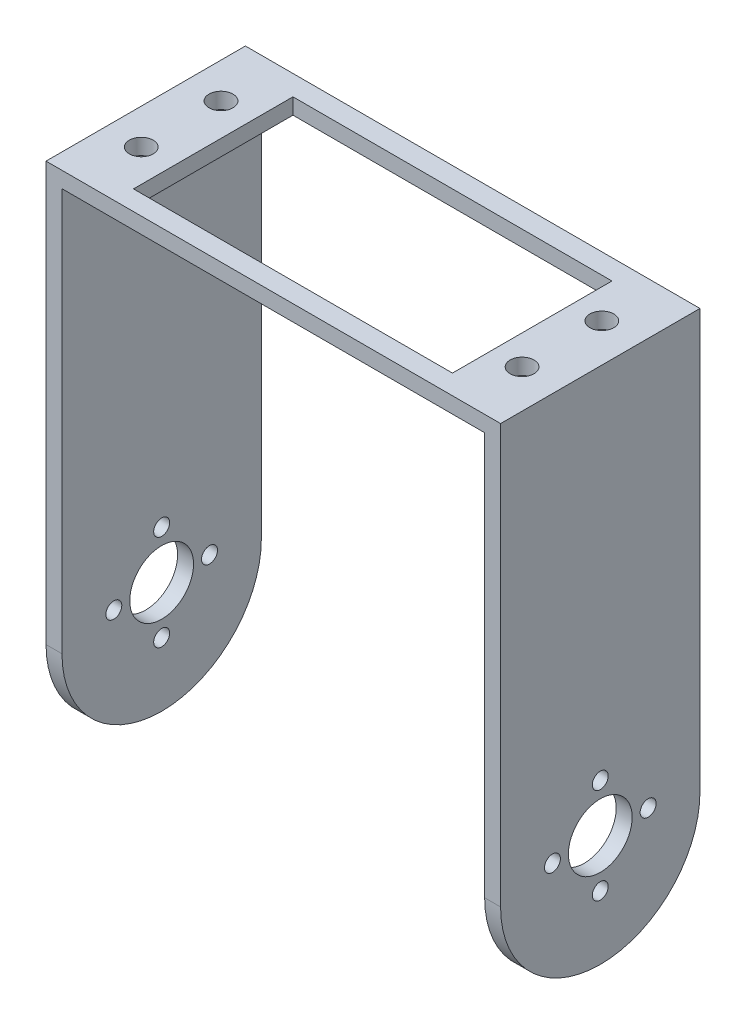
ISO-10303-21;
HEADER;
FILE_DESCRIPTION(('STEP AP214'),'2;1');
FILE_NAME('part.step','',(''),(''),'','','');
FILE_SCHEMA(('AUTOMOTIVE_DESIGN { 1 0 10303 214 1 1 1 1 }'));
ENDSEC;
DATA;
#1=APPLICATION_CONTEXT('core data for automotive mechanical design processes');
#2=APPLICATION_PROTOCOL_DEFINITION('international standard','automotive_design',2000,#1);
#3=PRODUCT_CONTEXT('',#1,'mechanical');
#4=PRODUCT('Part','Part','',(#3));
#5=PRODUCT_RELATED_PRODUCT_CATEGORY('part','',(#4));
#6=PRODUCT_DEFINITION_FORMATION('','',#4);
#7=PRODUCT_DEFINITION_CONTEXT('part definition',#1,'design');
#8=PRODUCT_DEFINITION('design','',#6,#7);
#9=PRODUCT_DEFINITION_SHAPE('','',#8);
#10=(LENGTH_UNIT() NAMED_UNIT(*) SI_UNIT(.MILLI.,.METRE.));
#11=(NAMED_UNIT(*) PLANE_ANGLE_UNIT() SI_UNIT($,.RADIAN.));
#12=(NAMED_UNIT(*) SI_UNIT($,.STERADIAN.) SOLID_ANGLE_UNIT());
#13=UNCERTAINTY_MEASURE_WITH_UNIT(LENGTH_MEASURE(1.E-05),#10,'distance_accuracy_value','');
#14=(GEOMETRIC_REPRESENTATION_CONTEXT(3) GLOBAL_UNCERTAINTY_ASSIGNED_CONTEXT((#13)) GLOBAL_UNIT_ASSIGNED_CONTEXT((#10,
#11,#12)) REPRESENTATION_CONTEXT('',''));
#15=CARTESIAN_POINT('',(0.,0.,0.));
#16=DIRECTION('',(0.,0.,1.));
#17=DIRECTION('',(1.,0.,0.));
#18=AXIS2_PLACEMENT_3D('',#15,#16,#17);
#19=CARTESIAN_POINT('',(-79.925523148209,43.3899538371544,25.));
#20=DIRECTION('',(-1.,0.,0.));
#21=DIRECTION('',(0.,0.,1.));
#22=AXIS2_PLACEMENT_3D('',#19,#20,#21);
#23=PLANE('',#22);
#24=CARTESIAN_POINT('',(-79.925523148209,0.386502583504423,12.5));
#25=DIRECTION('',(-1.,0.,0.));
#26=DIRECTION('',(0.,0.,1.));
#27=AXIS2_PLACEMENT_3D('',#24,#25,#26);
#28=CIRCLE('',#27,1.);
#29=CARTESIAN_POINT('',(-79.925523148209,0.386502583504423,13.5));
#30=VERTEX_POINT('',#29);
#31=EDGE_CURVE('E180',#30,#30,#28,.T.);
#32=ORIENTED_EDGE('',*,*,#31,.T.);
#33=EDGE_LOOP('',(#32));
#34=FACE_BOUND('',#33,.T.);
#35=CARTESIAN_POINT('',(-79.925523148209,-5.6134974164956,18.4999999999999));
#36=DIRECTION('',(-1.,0.,0.));
#37=DIRECTION('',(0.,0.,1.));
#38=AXIS2_PLACEMENT_3D('',#35,#36,#37);
#39=CIRCLE('',#38,1.);
#40=CARTESIAN_POINT('',(-79.925523148209,-5.6134974164956,19.4999999999999));
#41=VERTEX_POINT('',#40);
#42=EDGE_CURVE('E192',#41,#41,#39,.T.);
#43=ORIENTED_EDGE('',*,*,#42,.T.);
#44=EDGE_LOOP('',(#43));
#45=FACE_BOUND('',#44,.T.);
#46=CARTESIAN_POINT('',(-79.925523148209,-11.6134974164956,12.4999999999999));
#47=DIRECTION('',(-1.,0.,0.));
#48=DIRECTION('',(0.,0.,1.));
#49=AXIS2_PLACEMENT_3D('',#46,#47,#48);
#50=CIRCLE('',#49,1.);
#51=CARTESIAN_POINT('',(-79.925523148209,-11.6134974164956,13.4999999999999));
#52=VERTEX_POINT('',#51);
#53=EDGE_CURVE('E204',#52,#52,#50,.T.);
#54=ORIENTED_EDGE('',*,*,#53,.T.);
#55=EDGE_LOOP('',(#54));
#56=FACE_BOUND('',#55,.T.);
#57=CARTESIAN_POINT('',(-79.925523148209,-5.61349741649551,6.49999999999991));
#58=DIRECTION('',(-1.,0.,0.));
#59=DIRECTION('',(0.,0.,1.));
#60=AXIS2_PLACEMENT_3D('',#57,#58,#59);
#61=CIRCLE('',#60,1.);
#62=CARTESIAN_POINT('',(-79.925523148209,-5.61349741649551,7.49999999999992));
#63=VERTEX_POINT('',#62);
#64=EDGE_CURVE('E216',#63,#63,#61,.T.);
#65=ORIENTED_EDGE('',*,*,#64,.T.);
#66=EDGE_LOOP('',(#65));
#67=FACE_BOUND('',#66,.T.);
#68=CARTESIAN_POINT('',(-79.925523148209,-5.61349741649557,12.5));
#69=DIRECTION('',(-1.,0.,0.));
#70=DIRECTION('',(0.,0.,1.));
#71=AXIS2_PLACEMENT_3D('',#68,#69,#70);
#72=CIRCLE('',#71,4.);
#73=CARTESIAN_POINT('',(-79.925523148209,-5.61349741649557,16.5));
#74=VERTEX_POINT('',#73);
#75=EDGE_CURVE('E242',#74,#74,#72,.T.);
#76=ORIENTED_EDGE('',*,*,#75,.T.);
#77=EDGE_LOOP('',(#76));
#78=FACE_BOUND('',#77,.T.);
#79=DIRECTION('',(0.,1.,0.));
#80=VECTOR('',#79,1.);
#81=CARTESIAN_POINT('',(-79.925523148209,43.3899538371544,25.));
#82=LINE('',#81,#80);
#83=CARTESIAN_POINT('',(-79.925523148209,-7.11349741649558,25.));
#84=VERTEX_POINT('',#83);
#85=CARTESIAN_POINT('',(-79.925523148209,43.3899538371544,25.));
#86=VERTEX_POINT('',#85);
#87=EDGE_CURVE('E246',#84,#86,#82,.T.);
#88=ORIENTED_EDGE('',*,*,#87,.F.);
#89=CARTESIAN_POINT('',(-79.925523148209,-7.11349741649558,12.5));
#90=DIRECTION('',(-1.,0.,0.));
#91=DIRECTION('',(0.,0.,1.));
#92=AXIS2_PLACEMENT_3D('',#89,#90,#91);
#93=CIRCLE('',#92,12.5);
#94=CARTESIAN_POINT('',(-79.925523148209,-7.11349741649558,0.));
#95=VERTEX_POINT('',#94);
#96=EDGE_CURVE('E231',#95,#84,#93,.T.);
#97=ORIENTED_EDGE('',*,*,#96,.F.);
#98=DIRECTION('',(0.,1.,0.));
#99=VECTOR('',#98,1.);
#100=CARTESIAN_POINT('',(-79.925523148209,43.3899538371544,0.));
#101=LINE('',#100,#99);
#102=CARTESIAN_POINT('',(-79.925523148209,43.3899538371544,0.));
#103=VERTEX_POINT('',#102);
#104=EDGE_CURVE('E245',#95,#103,#101,.T.);
#105=ORIENTED_EDGE('',*,*,#104,.T.);
#106=DIRECTION('',(0.,0.,-1.));
#107=VECTOR('',#106,1.);
#108=CARTESIAN_POINT('',(-79.925523148209,43.3899538371544,25.));
#109=LINE('',#108,#107);
#110=EDGE_CURVE('E282',#86,#103,#109,.T.);
#111=ORIENTED_EDGE('',*,*,#110,.F.);
#112=EDGE_LOOP('',(#88,#97,#105,#111));
#113=FACE_BOUND('',#112,.T.);
#114=ADVANCED_FACE('F34',(#34,#45,#56,#67,#78,#113),#23,.F.);
#115=CARTESIAN_POINT('',(-26.925523148209,43.3899538371544,25.));
#116=DIRECTION('',(1.,0.,0.));
#117=DIRECTION('',(0.,1.,0.));
#118=AXIS2_PLACEMENT_3D('',#115,#116,#117);
#119=PLANE('',#118);
#120=CARTESIAN_POINT('',(-26.925523148209,0.38650258350444,12.5));
#121=DIRECTION('',(1.,0.,0.));
#122=DIRECTION('',(0.,1.,0.));
#123=AXIS2_PLACEMENT_3D('',#120,#121,#122);
#124=CIRCLE('',#123,1.);
#125=CARTESIAN_POINT('',(-26.925523148209,1.38650258350444,12.5));
#126=VERTEX_POINT('',#125);
#127=EDGE_CURVE('E175',#126,#126,#124,.T.);
#128=ORIENTED_EDGE('',*,*,#127,.T.);
#129=EDGE_LOOP('',(#128));
#130=FACE_BOUND('',#129,.T.);
#131=CARTESIAN_POINT('',(-26.925523148209,-5.61349741649558,18.4999999999999));
#132=DIRECTION('',(1.,0.,0.));
#133=DIRECTION('',(0.,1.,0.));
#134=AXIS2_PLACEMENT_3D('',#131,#132,#133);
#135=CIRCLE('',#134,1.);
#136=CARTESIAN_POINT('',(-26.925523148209,-4.61349741649558,18.4999999999999));
#137=VERTEX_POINT('',#136);
#138=EDGE_CURVE('E187',#137,#137,#135,.T.);
#139=ORIENTED_EDGE('',*,*,#138,.T.);
#140=EDGE_LOOP('',(#139));
#141=FACE_BOUND('',#140,.T.);
#142=CARTESIAN_POINT('',(-26.925523148209,-11.6134974164956,12.4999999999999));
#143=DIRECTION('',(1.,0.,0.));
#144=DIRECTION('',(0.,1.,0.));
#145=AXIS2_PLACEMENT_3D('',#142,#143,#144);
#146=CIRCLE('',#145,1.);
#147=CARTESIAN_POINT('',(-26.925523148209,-10.6134974164956,12.4999999999999));
#148=VERTEX_POINT('',#147);
#149=EDGE_CURVE('E199',#148,#148,#146,.T.);
#150=ORIENTED_EDGE('',*,*,#149,.T.);
#151=EDGE_LOOP('',(#150));
#152=FACE_BOUND('',#151,.T.);
#153=CARTESIAN_POINT('',(-26.925523148209,-5.6134974164955,6.49999999999991));
#154=DIRECTION('',(1.,0.,0.));
#155=DIRECTION('',(0.,1.,0.));
#156=AXIS2_PLACEMENT_3D('',#153,#154,#155);
#157=CIRCLE('',#156,1.);
#158=CARTESIAN_POINT('',(-26.925523148209,-4.6134974164955,6.49999999999991));
#159=VERTEX_POINT('',#158);
#160=EDGE_CURVE('E211',#159,#159,#157,.T.);
#161=ORIENTED_EDGE('',*,*,#160,.T.);
#162=EDGE_LOOP('',(#161));
#163=FACE_BOUND('',#162,.T.);
#164=CARTESIAN_POINT('',(-26.925523148209,-5.61349741649556,12.5));
#165=DIRECTION('',(1.,0.,0.));
#166=DIRECTION('',(0.,1.,0.));
#167=AXIS2_PLACEMENT_3D('',#164,#165,#166);
#168=CIRCLE('',#167,4.);
#169=CARTESIAN_POINT('',(-26.925523148209,-1.61349741649556,12.5));
#170=VERTEX_POINT('',#169);
#171=EDGE_CURVE('E237',#170,#170,#168,.T.);
#172=ORIENTED_EDGE('',*,*,#171,.T.);
#173=EDGE_LOOP('',(#172));
#174=FACE_BOUND('',#173,.T.);
#175=CARTESIAN_POINT('',(-26.925523148209,-7.11349741649557,12.5));
#176=DIRECTION('',(1.,0.,0.));
#177=DIRECTION('',(0.,1.,0.));
#178=AXIS2_PLACEMENT_3D('',#175,#176,#177);
#179=CIRCLE('',#178,12.5);
#180=CARTESIAN_POINT('',(-26.925523148209,-7.11349741649557,25.));
#181=VERTEX_POINT('',#180);
#182=CARTESIAN_POINT('',(-26.925523148209,-7.11349741649558,0.));
#183=VERTEX_POINT('',#182);
#184=EDGE_CURVE('E229',#181,#183,#179,.T.);
#185=ORIENTED_EDGE('',*,*,#184,.F.);
#186=DIRECTION('',(0.,-1.,0.));
#187=VECTOR('',#186,1.);
#188=CARTESIAN_POINT('',(-26.925523148209,43.3899538371544,25.));
#189=LINE('',#188,#187);
#190=CARTESIAN_POINT('',(-26.925523148209,43.3899538371544,25.));
#191=VERTEX_POINT('',#190);
#192=EDGE_CURVE('E251',#191,#181,#189,.T.);
#193=ORIENTED_EDGE('',*,*,#192,.F.);
#194=DIRECTION('',(0.,0.,-1.));
#195=VECTOR('',#194,1.);
#196=CARTESIAN_POINT('',(-26.925523148209,43.3899538371544,25.));
#197=LINE('',#196,#195);
#198=CARTESIAN_POINT('',(-26.925523148209,43.3899538371544,0.));
#199=VERTEX_POINT('',#198);
#200=EDGE_CURVE('E279',#191,#199,#197,.T.);
#201=ORIENTED_EDGE('',*,*,#200,.T.);
#202=DIRECTION('',(0.,-1.,0.));
#203=VECTOR('',#202,1.);
#204=CARTESIAN_POINT('',(-26.925523148209,43.3899538371544,0.));
#205=LINE('',#204,#203);
#206=EDGE_CURVE('E265',#199,#183,#205,.T.);
#207=ORIENTED_EDGE('',*,*,#206,.T.);
#208=EDGE_LOOP('',(#185,#193,#201,#207));
#209=FACE_BOUND('',#208,.T.);
#210=ADVANCED_FACE('F314',(#130,#141,#152,#163,#174,#209),#119,.F.);
#211=CARTESIAN_POINT('',(-24.925523148209,45.3865025835044,25.));
#212=DIRECTION('',(-1.,0.,0.));
#213=DIRECTION('',(0.,-1.,0.));
#214=AXIS2_PLACEMENT_3D('',#211,#212,#213);
#215=PLANE('',#214);
#216=CARTESIAN_POINT('',(-24.925523148209,0.38650258350444,12.5));
#217=DIRECTION('',(1.,0.,0.));
#218=DIRECTION('',(0.,1.,0.));
#219=AXIS2_PLACEMENT_3D('',#216,#217,#218);
#220=CIRCLE('',#219,1.);
#221=CARTESIAN_POINT('',(-24.925523148209,1.38650258350444,12.5));
#222=VERTEX_POINT('',#221);
#223=EDGE_CURVE('E171',#222,#222,#220,.T.);
#224=ORIENTED_EDGE('',*,*,#223,.F.);
#225=EDGE_LOOP('',(#224));
#226=FACE_BOUND('',#225,.T.);
#227=CARTESIAN_POINT('',(-24.925523148209,-5.61349741649558,18.4999999999999));
#228=DIRECTION('',(1.,0.,0.));
#229=DIRECTION('',(0.,1.,0.));
#230=AXIS2_PLACEMENT_3D('',#227,#228,#229);
#231=CIRCLE('',#230,1.);
#232=CARTESIAN_POINT('',(-24.925523148209,-4.61349741649558,18.4999999999999));
#233=VERTEX_POINT('',#232);
#234=EDGE_CURVE('E183',#233,#233,#231,.T.);
#235=ORIENTED_EDGE('',*,*,#234,.F.);
#236=EDGE_LOOP('',(#235));
#237=FACE_BOUND('',#236,.T.);
#238=CARTESIAN_POINT('',(-24.925523148209,-11.6134974164956,12.4999999999999));
#239=DIRECTION('',(1.,0.,0.));
#240=DIRECTION('',(0.,1.,0.));
#241=AXIS2_PLACEMENT_3D('',#238,#239,#240);
#242=CIRCLE('',#241,1.);
#243=CARTESIAN_POINT('',(-24.925523148209,-10.6134974164956,12.4999999999999));
#244=VERTEX_POINT('',#243);
#245=EDGE_CURVE('E195',#244,#244,#242,.T.);
#246=ORIENTED_EDGE('',*,*,#245,.F.);
#247=EDGE_LOOP('',(#246));
#248=FACE_BOUND('',#247,.T.);
#249=CARTESIAN_POINT('',(-24.925523148209,-5.6134974164955,6.49999999999991));
#250=DIRECTION('',(1.,0.,0.));
#251=DIRECTION('',(0.,1.,0.));
#252=AXIS2_PLACEMENT_3D('',#249,#250,#251);
#253=CIRCLE('',#252,1.);
#254=CARTESIAN_POINT('',(-24.925523148209,-4.61349741649549,6.49999999999991));
#255=VERTEX_POINT('',#254);
#256=EDGE_CURVE('E207',#255,#255,#253,.T.);
#257=ORIENTED_EDGE('',*,*,#256,.F.);
#258=EDGE_LOOP('',(#257));
#259=FACE_BOUND('',#258,.T.);
#260=CARTESIAN_POINT('',(-24.9255231482089,-5.61349741649556,12.5));
#261=DIRECTION('',(-1.,0.,0.));
#262=DIRECTION('',(0.,-1.,0.));
#263=AXIS2_PLACEMENT_3D('',#260,#261,#262);
#264=CIRCLE('',#263,4.);
#265=CARTESIAN_POINT('',(-24.9255231482089,-9.61349741649556,12.5));
#266=VERTEX_POINT('',#265);
#267=EDGE_CURVE('E234',#266,#266,#264,.T.);
#268=ORIENTED_EDGE('',*,*,#267,.T.);
#269=EDGE_LOOP('',(#268));
#270=FACE_BOUND('',#269,.T.);
#271=DIRECTION('',(0.,1.,0.));
#272=VECTOR('',#271,1.);
#273=CARTESIAN_POINT('',(-24.925523148209,45.3865025835044,25.));
#274=LINE('',#273,#272);
#275=CARTESIAN_POINT('',(-24.9255231482089,-7.11349741649557,25.));
#276=VERTEX_POINT('',#275);
#277=CARTESIAN_POINT('',(-24.925523148209,45.3865025835044,25.));
#278=VERTEX_POINT('',#277);
#279=EDGE_CURVE('E254',#276,#278,#274,.T.);
#280=ORIENTED_EDGE('',*,*,#279,.F.);
#281=CARTESIAN_POINT('',(-24.9255231482089,-7.11349741649557,12.5));
#282=DIRECTION('',(-1.,0.,0.));
#283=DIRECTION('',(0.,-1.,0.));
#284=AXIS2_PLACEMENT_3D('',#281,#282,#283);
#285=CIRCLE('',#284,12.5);
#286=CARTESIAN_POINT('',(-24.9255231482089,-7.11349741649557,0.));
#287=VERTEX_POINT('',#286);
#288=EDGE_CURVE('E223',#287,#276,#285,.T.);
#289=ORIENTED_EDGE('',*,*,#288,.F.);
#290=DIRECTION('',(0.,1.,0.));
#291=VECTOR('',#290,1.);
#292=CARTESIAN_POINT('',(-24.925523148209,45.3865025835044,0.));
#293=LINE('',#292,#291);
#294=CARTESIAN_POINT('',(-24.925523148209,45.3865025835044,0.));
#295=VERTEX_POINT('',#294);
#296=EDGE_CURVE('E268',#287,#295,#293,.T.);
#297=ORIENTED_EDGE('',*,*,#296,.T.);
#298=DIRECTION('',(0.,0.,-1.));
#299=VECTOR('',#298,1.);
#300=CARTESIAN_POINT('',(-24.925523148209,45.3865025835044,25.));
#301=LINE('',#300,#299);
#302=EDGE_CURVE('E276',#278,#295,#301,.T.);
#303=ORIENTED_EDGE('',*,*,#302,.F.);
#304=EDGE_LOOP('',(#280,#289,#297,#303));
#305=FACE_BOUND('',#304,.T.);
#306=ADVANCED_FACE('F304',(#226,#237,#248,#259,#270,#305),#215,.F.);
#307=CARTESIAN_POINT('',(-81.925523148209,45.3865025835044,25.));
#308=DIRECTION('',(1.,0.,0.));
#309=DIRECTION('',(0.,1.,0.));
#310=AXIS2_PLACEMENT_3D('',#307,#308,#309);
#311=PLANE('',#310);
#312=CARTESIAN_POINT('',(-81.925523148209,0.386502583504422,12.5));
#313=DIRECTION('',(1.,0.,0.));
#314=DIRECTION('',(0.,1.,0.));
#315=AXIS2_PLACEMENT_3D('',#312,#313,#314);
#316=CIRCLE('',#315,1.);
#317=CARTESIAN_POINT('',(-81.925523148209,1.38650258350442,12.5));
#318=VERTEX_POINT('',#317);
#319=EDGE_CURVE('E172',#318,#318,#316,.T.);
#320=ORIENTED_EDGE('',*,*,#319,.T.);
#321=EDGE_LOOP('',(#320));
#322=FACE_BOUND('',#321,.T.);
#323=CARTESIAN_POINT('',(-81.925523148209,-5.6134974164956,18.4999999999999));
#324=DIRECTION('',(1.,0.,0.));
#325=DIRECTION('',(0.,1.,0.));
#326=AXIS2_PLACEMENT_3D('',#323,#324,#325);
#327=CIRCLE('',#326,1.);
#328=CARTESIAN_POINT('',(-81.925523148209,-4.6134974164956,18.4999999999999));
#329=VERTEX_POINT('',#328);
#330=EDGE_CURVE('E184',#329,#329,#327,.T.);
#331=ORIENTED_EDGE('',*,*,#330,.T.);
#332=EDGE_LOOP('',(#331));
#333=FACE_BOUND('',#332,.T.);
#334=CARTESIAN_POINT('',(-81.925523148209,-11.6134974164956,12.4999999999999));
#335=DIRECTION('',(1.,0.,0.));
#336=DIRECTION('',(0.,1.,0.));
#337=AXIS2_PLACEMENT_3D('',#334,#335,#336);
#338=CIRCLE('',#337,1.);
#339=CARTESIAN_POINT('',(-81.925523148209,-10.6134974164956,12.4999999999999));
#340=VERTEX_POINT('',#339);
#341=EDGE_CURVE('E196',#340,#340,#338,.T.);
#342=ORIENTED_EDGE('',*,*,#341,.T.);
#343=EDGE_LOOP('',(#342));
#344=FACE_BOUND('',#343,.T.);
#345=CARTESIAN_POINT('',(-81.925523148209,-5.61349741649551,6.49999999999991));
#346=DIRECTION('',(1.,0.,0.));
#347=DIRECTION('',(0.,1.,0.));
#348=AXIS2_PLACEMENT_3D('',#345,#346,#347);
#349=CIRCLE('',#348,1.);
#350=CARTESIAN_POINT('',(-81.925523148209,-4.61349741649551,6.49999999999991));
#351=VERTEX_POINT('',#350);
#352=EDGE_CURVE('E208',#351,#351,#349,.T.);
#353=ORIENTED_EDGE('',*,*,#352,.T.);
#354=EDGE_LOOP('',(#353));
#355=FACE_BOUND('',#354,.T.);
#356=CARTESIAN_POINT('',(-81.925523148209,-5.61349741649557,12.5));
#357=DIRECTION('',(-1.,0.,0.));
#358=DIRECTION('',(0.,-1.,0.));
#359=AXIS2_PLACEMENT_3D('',#356,#357,#358);
#360=CIRCLE('',#359,4.);
#361=CARTESIAN_POINT('',(-81.925523148209,-9.61349741649557,12.5));
#362=VERTEX_POINT('',#361);
#363=EDGE_CURVE('E233',#362,#362,#360,.T.);
#364=ORIENTED_EDGE('',*,*,#363,.F.);
#365=EDGE_LOOP('',(#364));
#366=FACE_BOUND('',#365,.T.);
#367=CARTESIAN_POINT('',(-81.925523148209,-7.11349741649558,12.5));
#368=DIRECTION('',(-1.,0.,0.));
#369=DIRECTION('',(0.,-1.,0.));
#370=AXIS2_PLACEMENT_3D('',#367,#368,#369);
#371=CIRCLE('',#370,12.5);
#372=CARTESIAN_POINT('',(-81.925523148209,-7.11349741649558,0.));
#373=VERTEX_POINT('',#372);
#374=CARTESIAN_POINT('',(-81.925523148209,-7.11349741649558,25.));
#375=VERTEX_POINT('',#374);
#376=EDGE_CURVE('E222',#373,#375,#371,.T.);
#377=ORIENTED_EDGE('',*,*,#376,.T.);
#378=DIRECTION('',(0.,-1.,0.));
#379=VECTOR('',#378,1.);
#380=CARTESIAN_POINT('',(-81.925523148209,45.3865025835044,25.));
#381=LINE('',#380,#379);
#382=CARTESIAN_POINT('',(-81.925523148209,45.3865025835044,25.));
#383=VERTEX_POINT('',#382);
#384=EDGE_CURVE('E258',#383,#375,#381,.T.);
#385=ORIENTED_EDGE('',*,*,#384,.F.);
#386=DIRECTION('',(0.,0.,-1.));
#387=VECTOR('',#386,1.);
#388=CARTESIAN_POINT('',(-81.925523148209,45.3865025835044,25.));
#389=LINE('',#388,#387);
#390=CARTESIAN_POINT('',(-81.925523148209,45.3865025835044,0.));
#391=VERTEX_POINT('',#390);
#392=EDGE_CURVE('E261',#383,#391,#389,.T.);
#393=ORIENTED_EDGE('',*,*,#392,.T.);
#394=DIRECTION('',(0.,-1.,0.));
#395=VECTOR('',#394,1.);
#396=CARTESIAN_POINT('',(-81.925523148209,45.3865025835044,0.));
#397=LINE('',#396,#395);
#398=EDGE_CURVE('E249',#391,#373,#397,.T.);
#399=ORIENTED_EDGE('',*,*,#398,.T.);
#400=EDGE_LOOP('',(#377,#385,#393,#399));
#401=FACE_BOUND('',#400,.T.);
#402=ADVANCED_FACE('F295',(#322,#333,#344,#355,#366,#401),#311,.F.);
#403=CARTESIAN_POINT('',(-79.925523148209,43.3899538371544,25.));
#404=DIRECTION('',(0.,1.,0.));
#405=DIRECTION('',(0.,0.,1.));
#406=AXIS2_PLACEMENT_3D('',#403,#404,#405);
#407=PLANE('',#406);
#408=CARTESIAN_POINT('',(-29.7325728017672,43.3899538371544,7.5));
#409=DIRECTION('',(0.,1.,0.));
#410=DIRECTION('',(0.,0.,1.));
#411=AXIS2_PLACEMENT_3D('',#408,#409,#410);
#412=CIRCLE('',#411,1.5);
#413=CARTESIAN_POINT('',(-29.7325728017672,43.3899538371544,9.));
#414=VERTEX_POINT('',#413);
#415=EDGE_CURVE('E168',#414,#414,#412,.T.);
#416=ORIENTED_EDGE('',*,*,#415,.T.);
#417=EDGE_LOOP('',(#416));
#418=FACE_BOUND('',#417,.T.);
#419=CARTESIAN_POINT('',(-77.4867576969271,43.3899538371544,7.5));
#420=DIRECTION('',(0.,1.,0.));
#421=DIRECTION('',(0.,0.,1.));
#422=AXIS2_PLACEMENT_3D('',#419,#420,#421);
#423=CIRCLE('',#422,1.5);
#424=CARTESIAN_POINT('',(-77.4867576969271,43.3899538371544,9.));
#425=VERTEX_POINT('',#424);
#426=EDGE_CURVE('E165',#425,#425,#423,.T.);
#427=ORIENTED_EDGE('',*,*,#426,.T.);
#428=EDGE_LOOP('',(#427));
#429=FACE_BOUND('',#428,.T.);
#430=CARTESIAN_POINT('',(-29.7325728017672,43.3899538371544,17.5));
#431=DIRECTION('',(0.,1.,0.));
#432=DIRECTION('',(0.,0.,1.));
#433=AXIS2_PLACEMENT_3D('',#430,#431,#432);
#434=CIRCLE('',#433,1.5);
#435=CARTESIAN_POINT('',(-29.7325728017672,43.3899538371544,19.));
#436=VERTEX_POINT('',#435);
#437=EDGE_CURVE('E162',#436,#436,#434,.T.);
#438=ORIENTED_EDGE('',*,*,#437,.T.);
#439=EDGE_LOOP('',(#438));
#440=FACE_BOUND('',#439,.T.);
#441=CARTESIAN_POINT('',(-77.4867576969271,43.3899538371544,17.5));
#442=DIRECTION('',(0.,1.,0.));
#443=DIRECTION('',(0.,0.,1.));
#444=AXIS2_PLACEMENT_3D('',#441,#442,#443);
#445=CIRCLE('',#444,1.5);
#446=CARTESIAN_POINT('',(-77.4867576969271,43.3899538371544,19.));
#447=VERTEX_POINT('',#446);
#448=EDGE_CURVE('E159',#447,#447,#445,.T.);
#449=ORIENTED_EDGE('',*,*,#448,.T.);
#450=EDGE_LOOP('',(#449));
#451=FACE_BOUND('',#450,.T.);
#452=DIRECTION('',(-1.,0.,0.));
#453=VECTOR('',#452,1.);
#454=CARTESIAN_POINT('',(-79.925523148209,43.3899538371544,2.53574451202888));
#455=LINE('',#454,#453);
#456=CARTESIAN_POINT('',(-33.425523148209,43.3899538371544,2.53574451202888));
#457=VERTEX_POINT('',#456);
#458=CARTESIAN_POINT('',(-73.425523148209,43.3899538371544,2.53574451202888));
#459=VERTEX_POINT('',#458);
#460=EDGE_CURVE('E153',#457,#459,#455,.T.);
#461=ORIENTED_EDGE('',*,*,#460,.T.);
#462=DIRECTION('',(0.,0.,1.));
#463=VECTOR('',#462,1.);
#464=CARTESIAN_POINT('',(-73.425523148209,43.3899538371544,25.));
#465=LINE('',#464,#463);
#466=CARTESIAN_POINT('',(-73.425523148209,43.3899538371544,22.5357445120289));
#467=VERTEX_POINT('',#466);
#468=EDGE_CURVE('E156',#459,#467,#465,.T.);
#469=ORIENTED_EDGE('',*,*,#468,.T.);
#470=DIRECTION('',(1.,0.,0.));
#471=VECTOR('',#470,1.);
#472=CARTESIAN_POINT('',(-79.925523148209,43.3899538371544,22.5357445120289));
#473=LINE('',#472,#471);
#474=CARTESIAN_POINT('',(-33.425523148209,43.3899538371544,22.5357445120289));
#475=VERTEX_POINT('',#474);
#476=EDGE_CURVE('E148',#467,#475,#473,.T.);
#477=ORIENTED_EDGE('',*,*,#476,.T.);
#478=DIRECTION('',(0.,0.,-1.));
#479=VECTOR('',#478,1.);
#480=CARTESIAN_POINT('',(-33.425523148209,43.3899538371544,25.));
#481=LINE('',#480,#479);
#482=EDGE_CURVE('E128',#475,#457,#481,.T.);
#483=ORIENTED_EDGE('',*,*,#482,.T.);
#484=EDGE_LOOP('',(#461,#469,#477,#483));
#485=FACE_BOUND('',#484,.T.);
#486=DIRECTION('',(1.,0.,0.));
#487=VECTOR('',#486,1.);
#488=CARTESIAN_POINT('',(-79.925523148209,43.3899538371544,0.));
#489=LINE('',#488,#487);
#490=EDGE_CURVE('E263',#103,#199,#489,.T.);
#491=ORIENTED_EDGE('',*,*,#490,.T.);
#492=ORIENTED_EDGE('',*,*,#200,.F.);
#493=DIRECTION('',(1.,0.,0.));
#494=VECTOR('',#493,1.);
#495=CARTESIAN_POINT('',(-79.925523148209,43.3899538371544,25.));
#496=LINE('',#495,#494);
#497=EDGE_CURVE('E248',#86,#191,#496,.T.);
#498=ORIENTED_EDGE('',*,*,#497,.F.);
#499=ORIENTED_EDGE('',*,*,#110,.T.);
#500=EDGE_LOOP('',(#491,#492,#498,#499));
#501=FACE_BOUND('',#500,.T.);
#502=ADVANCED_FACE('F317',(#418,#429,#440,#451,#485,#501),#407,.F.);
#503=CARTESIAN_POINT('',(-81.925523148209,45.3865025835044,25.));
#504=DIRECTION('',(0.,-1.,0.));
#505=DIRECTION('',(0.,0.,-1.));
#506=AXIS2_PLACEMENT_3D('',#503,#504,#505);
#507=PLANE('',#506);
#508=CARTESIAN_POINT('',(-29.7325728017672,45.3865025835044,7.5));
#509=DIRECTION('',(0.,1.,0.));
#510=DIRECTION('',(0.,0.,1.));
#511=AXIS2_PLACEMENT_3D('',#508,#509,#510);
#512=CIRCLE('',#511,1.5);
#513=CARTESIAN_POINT('',(-29.7325728017672,45.3865025835044,9.));
#514=VERTEX_POINT('',#513);
#515=EDGE_CURVE('E545',#514,#514,#512,.T.);
#516=ORIENTED_EDGE('',*,*,#515,.F.);
#517=EDGE_LOOP('',(#516));
#518=FACE_BOUND('',#517,.T.);
#519=CARTESIAN_POINT('',(-77.4867576969271,45.3865025835044,7.5));
#520=DIRECTION('',(0.,1.,0.));
#521=DIRECTION('',(0.,0.,1.));
#522=AXIS2_PLACEMENT_3D('',#519,#520,#521);
#523=CIRCLE('',#522,1.5);
#524=CARTESIAN_POINT('',(-77.4867576969271,45.3865025835044,9.));
#525=VERTEX_POINT('',#524);
#526=EDGE_CURVE('E546',#525,#525,#523,.T.);
#527=ORIENTED_EDGE('',*,*,#526,.F.);
#528=EDGE_LOOP('',(#527));
#529=FACE_BOUND('',#528,.T.);
#530=CARTESIAN_POINT('',(-29.7325728017672,45.3865025835044,17.5));
#531=DIRECTION('',(0.,1.,0.));
#532=DIRECTION('',(0.,0.,1.));
#533=AXIS2_PLACEMENT_3D('',#530,#531,#532);
#534=CIRCLE('',#533,1.5);
#535=CARTESIAN_POINT('',(-29.7325728017672,45.3865025835044,19.));
#536=VERTEX_POINT('',#535);
#537=EDGE_CURVE('E549',#536,#536,#534,.T.);
#538=ORIENTED_EDGE('',*,*,#537,.F.);
#539=EDGE_LOOP('',(#538));
#540=FACE_BOUND('',#539,.T.);
#541=CARTESIAN_POINT('',(-77.4867576969271,45.3865025835044,17.5));
#542=DIRECTION('',(0.,1.,0.));
#543=DIRECTION('',(0.,0.,1.));
#544=AXIS2_PLACEMENT_3D('',#541,#542,#543);
#545=CIRCLE('',#544,1.5);
#546=CARTESIAN_POINT('',(-77.4867576969271,45.3865025835044,19.));
#547=VERTEX_POINT('',#546);
#548=EDGE_CURVE('E552',#547,#547,#545,.T.);
#549=ORIENTED_EDGE('',*,*,#548,.F.);
#550=EDGE_LOOP('',(#549));
#551=FACE_BOUND('',#550,.T.);
#552=DIRECTION('',(1.,0.,0.));
#553=VECTOR('',#552,1.);
#554=CARTESIAN_POINT('',(-73.425523148209,45.3865025835044,22.5357445120289));
#555=LINE('',#554,#553);
#556=CARTESIAN_POINT('',(-73.425523148209,45.3865025835044,22.5357445120289));
#557=VERTEX_POINT('',#556);
#558=CARTESIAN_POINT('',(-33.425523148209,45.3865025835044,22.5357445120289));
#559=VERTEX_POINT('',#558);
#560=EDGE_CURVE('E134',#557,#559,#555,.T.);
#561=ORIENTED_EDGE('',*,*,#560,.F.);
#562=DIRECTION('',(0.,0.,1.));
#563=VECTOR('',#562,1.);
#564=CARTESIAN_POINT('',(-73.425523148209,45.3865025835044,2.53574451202888));
#565=LINE('',#564,#563);
#566=CARTESIAN_POINT('',(-73.425523148209,45.3865025835044,2.53574451202888));
#567=VERTEX_POINT('',#566);
#568=EDGE_CURVE('E56',#567,#557,#565,.T.);
#569=ORIENTED_EDGE('',*,*,#568,.F.);
#570=DIRECTION('',(-1.,0.,0.));
#571=VECTOR('',#570,1.);
#572=CARTESIAN_POINT('',(-73.425523148209,45.3865025835044,2.53574451202888));
#573=LINE('',#572,#571);
#574=CARTESIAN_POINT('',(-33.425523148209,45.3865025835044,2.53574451202888));
#575=VERTEX_POINT('',#574);
#576=EDGE_CURVE('E141',#575,#567,#573,.T.);
#577=ORIENTED_EDGE('',*,*,#576,.F.);
#578=DIRECTION('',(0.,0.,-1.));
#579=VECTOR('',#578,1.);
#580=CARTESIAN_POINT('',(-33.425523148209,45.3865025835044,2.53574451202888));
#581=LINE('',#580,#579);
#582=EDGE_CURVE('E125',#559,#575,#581,.T.);
#583=ORIENTED_EDGE('',*,*,#582,.F.);
#584=EDGE_LOOP('',(#561,#569,#577,#583));
#585=FACE_BOUND('',#584,.T.);
#586=DIRECTION('',(-1.,0.,0.));
#587=VECTOR('',#586,1.);
#588=CARTESIAN_POINT('',(-81.925523148209,45.3865025835044,0.));
#589=LINE('',#588,#587);
#590=EDGE_CURVE('E270',#295,#391,#589,.T.);
#591=ORIENTED_EDGE('',*,*,#590,.T.);
#592=ORIENTED_EDGE('',*,*,#392,.F.);
#593=DIRECTION('',(-1.,0.,0.));
#594=VECTOR('',#593,1.);
#595=CARTESIAN_POINT('',(-27.0429671921119,45.3865025835044,25.));
#596=LINE('',#595,#594);
#597=EDGE_CURVE('E256',#278,#383,#596,.T.);
#598=ORIENTED_EDGE('',*,*,#597,.F.);
#599=ORIENTED_EDGE('',*,*,#302,.T.);
#600=EDGE_LOOP('',(#591,#592,#598,#599));
#601=FACE_BOUND('',#600,.T.);
#602=ADVANCED_FACE('F138',(#518,#529,#540,#551,#585,#601),#507,.F.);
#603=CARTESIAN_POINT('',(0.,0.,25.));
#604=DIRECTION('',(0.,0.,1.));
#605=DIRECTION('',(1.,0.,0.));
#606=AXIS2_PLACEMENT_3D('',#603,#604,#605);
#607=PLANE('',#606);
#608=DIRECTION('',(-1.,0.,0.));
#609=VECTOR('',#608,1.);
#610=CARTESIAN_POINT('',(-24.9255231482089,-7.11349741649557,25.));
#611=LINE('',#610,#609);
#612=EDGE_CURVE('E219',#276,#181,#611,.T.);
#613=ORIENTED_EDGE('',*,*,#612,.F.);
#614=ORIENTED_EDGE('',*,*,#279,.T.);
#615=ORIENTED_EDGE('',*,*,#597,.T.);
#616=ORIENTED_EDGE('',*,*,#384,.T.);
#617=DIRECTION('',(-1.,0.,0.));
#618=VECTOR('',#617,1.);
#619=CARTESIAN_POINT('',(-24.9255231482089,-7.11349741649557,25.));
#620=LINE('',#619,#618);
#621=EDGE_CURVE('E11',#84,#375,#620,.T.);
#622=ORIENTED_EDGE('',*,*,#621,.F.);
#623=ORIENTED_EDGE('',*,*,#87,.T.);
#624=ORIENTED_EDGE('',*,*,#497,.T.);
#625=ORIENTED_EDGE('',*,*,#192,.T.);
#626=EDGE_LOOP('',(#613,#614,#615,#616,#622,#623,#624,#625));
#627=FACE_BOUND('',#626,.T.);
#628=ADVANCED_FACE('F309',(#627),#607,.T.);
#629=CARTESIAN_POINT('',(0.,0.,0.));
#630=DIRECTION('',(0.,0.,1.));
#631=DIRECTION('',(1.,0.,0.));
#632=AXIS2_PLACEMENT_3D('',#629,#630,#631);
#633=PLANE('',#632);
#634=ORIENTED_EDGE('',*,*,#296,.F.);
#635=DIRECTION('',(-1.,0.,0.));
#636=VECTOR('',#635,1.);
#637=CARTESIAN_POINT('',(-24.9255231482089,-7.11349741649557,0.));
#638=LINE('',#637,#636);
#639=EDGE_CURVE('E225',#287,#183,#638,.T.);
#640=ORIENTED_EDGE('',*,*,#639,.T.);
#641=ORIENTED_EDGE('',*,*,#206,.F.);
#642=ORIENTED_EDGE('',*,*,#490,.F.);
#643=ORIENTED_EDGE('',*,*,#104,.F.);
#644=DIRECTION('',(-1.,0.,0.));
#645=VECTOR('',#644,1.);
#646=CARTESIAN_POINT('',(-24.9255231482089,-7.11349741649557,0.));
#647=LINE('',#646,#645);
#648=EDGE_CURVE('E41',#95,#373,#647,.T.);
#649=ORIENTED_EDGE('',*,*,#648,.T.);
#650=ORIENTED_EDGE('',*,*,#398,.F.);
#651=ORIENTED_EDGE('',*,*,#590,.F.);
#652=EDGE_LOOP('',(#634,#640,#641,#642,#643,#649,#650,#651));
#653=FACE_BOUND('',#652,.T.);
#654=ADVANCED_FACE('F289',(#653),#633,.F.);
#655=CARTESIAN_POINT('',(-24.9255231482089,-5.61349741649556,12.5));
#656=DIRECTION('',(-1.,0.,0.));
#657=DIRECTION('',(0.,-1.,0.));
#658=AXIS2_PLACEMENT_3D('',#655,#656,#657);
#659=CYLINDRICAL_SURFACE('',#658,4.);
#660=ORIENTED_EDGE('',*,*,#363,.T.);
#661=EDGE_LOOP('',(#660));
#662=FACE_BOUND('',#661,.T.);
#663=ORIENTED_EDGE('',*,*,#75,.F.);
#664=EDGE_LOOP('',(#663));
#665=FACE_BOUND('',#664,.T.);
#666=ADVANCED_FACE('F330',(#662,#665),#659,.F.);
#667=ORIENTED_EDGE('',*,*,#267,.F.);
#668=EDGE_LOOP('',(#667));
#669=FACE_BOUND('',#668,.T.);
#670=ORIENTED_EDGE('',*,*,#171,.F.);
#671=EDGE_LOOP('',(#670));
#672=FACE_BOUND('',#671,.T.);
#673=ADVANCED_FACE('F323',(#669,#672),#659,.F.);
#674=CARTESIAN_POINT('',(-24.9255231482089,-7.11349741649557,12.5));
#675=DIRECTION('',(-1.,0.,0.));
#676=DIRECTION('',(0.,-1.,0.));
#677=AXIS2_PLACEMENT_3D('',#674,#675,#676);
#678=CYLINDRICAL_SURFACE('',#677,12.5);
#679=ORIENTED_EDGE('',*,*,#96,.T.);
#680=ORIENTED_EDGE('',*,*,#621,.T.);
#681=ORIENTED_EDGE('',*,*,#376,.F.);
#682=ORIENTED_EDGE('',*,*,#648,.F.);
#683=EDGE_LOOP('',(#679,#680,#681,#682));
#684=FACE_BOUND('',#683,.T.);
#685=ADVANCED_FACE('F321',(#684),#678,.T.);
#686=ORIENTED_EDGE('',*,*,#184,.T.);
#687=ORIENTED_EDGE('',*,*,#639,.F.);
#688=ORIENTED_EDGE('',*,*,#288,.T.);
#689=ORIENTED_EDGE('',*,*,#612,.T.);
#690=EDGE_LOOP('',(#686,#687,#688,#689));
#691=FACE_BOUND('',#690,.T.);
#692=ADVANCED_FACE('F307',(#691),#678,.T.);
#693=CARTESIAN_POINT('',(-81.925523148209,-5.61349741649551,6.49999999999991));
#694=DIRECTION('',(1.,0.,0.));
#695=DIRECTION('',(0.,1.,0.));
#696=AXIS2_PLACEMENT_3D('',#693,#694,#695);
#697=CYLINDRICAL_SURFACE('',#696,1.);
#698=ORIENTED_EDGE('',*,*,#352,.F.);
#699=EDGE_LOOP('',(#698));
#700=FACE_BOUND('',#699,.T.);
#701=ORIENTED_EDGE('',*,*,#64,.F.);
#702=EDGE_LOOP('',(#701));
#703=FACE_BOUND('',#702,.T.);
#704=ADVANCED_FACE('F329',(#700,#703),#697,.F.);
#705=ORIENTED_EDGE('',*,*,#256,.T.);
#706=EDGE_LOOP('',(#705));
#707=FACE_BOUND('',#706,.T.);
#708=ORIENTED_EDGE('',*,*,#160,.F.);
#709=EDGE_LOOP('',(#708));
#710=FACE_BOUND('',#709,.T.);
#711=ADVANCED_FACE('F408',(#707,#710),#697,.F.);
#712=CARTESIAN_POINT('',(-81.925523148209,-11.6134974164956,12.4999999999999));
#713=DIRECTION('',(1.,0.,0.));
#714=DIRECTION('',(0.,1.,0.));
#715=AXIS2_PLACEMENT_3D('',#712,#713,#714);
#716=CYLINDRICAL_SURFACE('',#715,1.);
#717=ORIENTED_EDGE('',*,*,#341,.F.);
#718=EDGE_LOOP('',(#717));
#719=FACE_BOUND('',#718,.T.);
#720=ORIENTED_EDGE('',*,*,#53,.F.);
#721=EDGE_LOOP('',(#720));
#722=FACE_BOUND('',#721,.T.);
#723=ADVANCED_FACE('F406',(#719,#722),#716,.F.);
#724=ORIENTED_EDGE('',*,*,#245,.T.);
#725=EDGE_LOOP('',(#724));
#726=FACE_BOUND('',#725,.T.);
#727=ORIENTED_EDGE('',*,*,#149,.F.);
#728=EDGE_LOOP('',(#727));
#729=FACE_BOUND('',#728,.T.);
#730=ADVANCED_FACE('F404',(#726,#729),#716,.F.);
#731=CARTESIAN_POINT('',(-81.925523148209,-5.6134974164956,18.4999999999999));
#732=DIRECTION('',(1.,0.,0.));
#733=DIRECTION('',(0.,1.,0.));
#734=AXIS2_PLACEMENT_3D('',#731,#732,#733);
#735=CYLINDRICAL_SURFACE('',#734,1.);
#736=ORIENTED_EDGE('',*,*,#330,.F.);
#737=EDGE_LOOP('',(#736));
#738=FACE_BOUND('',#737,.T.);
#739=ORIENTED_EDGE('',*,*,#42,.F.);
#740=EDGE_LOOP('',(#739));
#741=FACE_BOUND('',#740,.T.);
#742=ADVANCED_FACE('F401',(#738,#741),#735,.F.);
#743=ORIENTED_EDGE('',*,*,#234,.T.);
#744=EDGE_LOOP('',(#743));
#745=FACE_BOUND('',#744,.T.);
#746=ORIENTED_EDGE('',*,*,#138,.F.);
#747=EDGE_LOOP('',(#746));
#748=FACE_BOUND('',#747,.T.);
#749=ADVANCED_FACE('F399',(#745,#748),#735,.F.);
#750=CARTESIAN_POINT('',(-81.925523148209,0.386502583504422,12.5));
#751=DIRECTION('',(1.,0.,0.));
#752=DIRECTION('',(0.,1.,0.));
#753=AXIS2_PLACEMENT_3D('',#750,#751,#752);
#754=CYLINDRICAL_SURFACE('',#753,1.);
#755=ORIENTED_EDGE('',*,*,#319,.F.);
#756=EDGE_LOOP('',(#755));
#757=FACE_BOUND('',#756,.T.);
#758=ORIENTED_EDGE('',*,*,#31,.F.);
#759=EDGE_LOOP('',(#758));
#760=FACE_BOUND('',#759,.T.);
#761=ADVANCED_FACE('F392',(#757,#760),#754,.F.);
#762=ORIENTED_EDGE('',*,*,#223,.T.);
#763=EDGE_LOOP('',(#762));
#764=FACE_BOUND('',#763,.T.);
#765=ORIENTED_EDGE('',*,*,#127,.F.);
#766=EDGE_LOOP('',(#765));
#767=FACE_BOUND('',#766,.T.);
#768=ADVANCED_FACE('F385',(#764,#767),#754,.F.);
#769=CARTESIAN_POINT('',(-73.425523148209,35.3865025835044,2.53574451202888));
#770=DIRECTION('',(-1.,0.,0.));
#771=DIRECTION('',(0.,0.,1.));
#772=AXIS2_PLACEMENT_3D('',#769,#770,#771);
#773=PLANE('',#772);
#774=DIRECTION('',(0.,1.,0.));
#775=VECTOR('',#774,1.);
#776=CARTESIAN_POINT('',(-73.425523148209,35.3865025835044,2.53574451202888));
#777=LINE('',#776,#775);
#778=EDGE_CURVE('E146',#459,#567,#777,.T.);
#779=ORIENTED_EDGE('',*,*,#778,.T.);
#780=ORIENTED_EDGE('',*,*,#568,.T.);
#781=DIRECTION('',(0.,1.,0.));
#782=VECTOR('',#781,1.);
#783=CARTESIAN_POINT('',(-73.425523148209,35.3865025835044,22.5357445120289));
#784=LINE('',#783,#782);
#785=EDGE_CURVE('E131',#467,#557,#784,.T.);
#786=ORIENTED_EDGE('',*,*,#785,.F.);
#787=ORIENTED_EDGE('',*,*,#468,.F.);
#788=EDGE_LOOP('',(#779,#780,#786,#787));
#789=FACE_BOUND('',#788,.T.);
#790=ADVANCED_FACE('F383',(#789),#773,.F.);
#791=CARTESIAN_POINT('',(-73.425523148209,35.3865025835044,2.53574451202888));
#792=DIRECTION('',(0.,0.,-1.));
#793=DIRECTION('',(-1.,0.,0.));
#794=AXIS2_PLACEMENT_3D('',#791,#792,#793);
#795=PLANE('',#794);
#796=DIRECTION('',(0.,1.,0.));
#797=VECTOR('',#796,1.);
#798=CARTESIAN_POINT('',(-33.425523148209,35.3865025835044,2.53574451202888));
#799=LINE('',#798,#797);
#800=EDGE_CURVE('E130',#457,#575,#799,.T.);
#801=ORIENTED_EDGE('',*,*,#800,.T.);
#802=ORIENTED_EDGE('',*,*,#576,.T.);
#803=ORIENTED_EDGE('',*,*,#778,.F.);
#804=ORIENTED_EDGE('',*,*,#460,.F.);
#805=EDGE_LOOP('',(#801,#802,#803,#804));
#806=FACE_BOUND('',#805,.T.);
#807=ADVANCED_FACE('F382',(#806),#795,.F.);
#808=CARTESIAN_POINT('',(-33.425523148209,35.3865025835044,2.53574451202888));
#809=DIRECTION('',(1.,0.,0.));
#810=DIRECTION('',(0.,0.,-1.));
#811=AXIS2_PLACEMENT_3D('',#808,#809,#810);
#812=PLANE('',#811);
#813=DIRECTION('',(0.,1.,0.));
#814=VECTOR('',#813,1.);
#815=CARTESIAN_POINT('',(-33.425523148209,35.3865025835044,22.5357445120289));
#816=LINE('',#815,#814);
#817=EDGE_CURVE('E48',#475,#559,#816,.T.);
#818=ORIENTED_EDGE('',*,*,#817,.T.);
#819=ORIENTED_EDGE('',*,*,#582,.T.);
#820=ORIENTED_EDGE('',*,*,#800,.F.);
#821=ORIENTED_EDGE('',*,*,#482,.F.);
#822=EDGE_LOOP('',(#818,#819,#820,#821));
#823=FACE_BOUND('',#822,.T.);
#824=ADVANCED_FACE('F122',(#823),#812,.F.);
#825=CARTESIAN_POINT('',(-73.425523148209,35.3865025835044,22.5357445120289));
#826=DIRECTION('',(0.,0.,1.));
#827=DIRECTION('',(1.,0.,0.));
#828=AXIS2_PLACEMENT_3D('',#825,#826,#827);
#829=PLANE('',#828);
#830=ORIENTED_EDGE('',*,*,#785,.T.);
#831=ORIENTED_EDGE('',*,*,#560,.T.);
#832=ORIENTED_EDGE('',*,*,#817,.F.);
#833=ORIENTED_EDGE('',*,*,#476,.F.);
#834=EDGE_LOOP('',(#830,#831,#832,#833));
#835=FACE_BOUND('',#834,.T.);
#836=ADVANCED_FACE('F135',(#835),#829,.F.);
#837=CARTESIAN_POINT('',(-77.4867576969271,35.3865025835044,17.5));
#838=DIRECTION('',(0.,1.,0.));
#839=DIRECTION('',(0.,0.,1.));
#840=AXIS2_PLACEMENT_3D('',#837,#838,#839);
#841=CYLINDRICAL_SURFACE('',#840,1.5);
#842=ORIENTED_EDGE('',*,*,#548,.T.);
#843=EDGE_LOOP('',(#842));
#844=FACE_BOUND('',#843,.T.);
#845=ORIENTED_EDGE('',*,*,#448,.F.);
#846=EDGE_LOOP('',(#845));
#847=FACE_BOUND('',#846,.T.);
#848=ADVANCED_FACE('F500',(#844,#847),#841,.F.);
#849=CARTESIAN_POINT('',(-29.7325728017672,35.3865025835044,17.5));
#850=DIRECTION('',(0.,1.,0.));
#851=DIRECTION('',(0.,0.,1.));
#852=AXIS2_PLACEMENT_3D('',#849,#850,#851);
#853=CYLINDRICAL_SURFACE('',#852,1.5);
#854=ORIENTED_EDGE('',*,*,#537,.T.);
#855=EDGE_LOOP('',(#854));
#856=FACE_BOUND('',#855,.T.);
#857=ORIENTED_EDGE('',*,*,#437,.F.);
#858=EDGE_LOOP('',(#857));
#859=FACE_BOUND('',#858,.T.);
#860=ADVANCED_FACE('F508',(#856,#859),#853,.F.);
#861=CARTESIAN_POINT('',(-77.4867576969271,35.3865025835044,7.5));
#862=DIRECTION('',(0.,1.,0.));
#863=DIRECTION('',(0.,0.,1.));
#864=AXIS2_PLACEMENT_3D('',#861,#862,#863);
#865=CYLINDRICAL_SURFACE('',#864,1.5);
#866=ORIENTED_EDGE('',*,*,#526,.T.);
#867=EDGE_LOOP('',(#866));
#868=FACE_BOUND('',#867,.T.);
#869=ORIENTED_EDGE('',*,*,#426,.F.);
#870=EDGE_LOOP('',(#869));
#871=FACE_BOUND('',#870,.T.);
#872=ADVANCED_FACE('F518',(#868,#871),#865,.F.);
#873=CARTESIAN_POINT('',(-29.7325728017672,35.3865025835044,7.5));
#874=DIRECTION('',(0.,1.,0.));
#875=DIRECTION('',(0.,0.,1.));
#876=AXIS2_PLACEMENT_3D('',#873,#874,#875);
#877=CYLINDRICAL_SURFACE('',#876,1.5);
#878=ORIENTED_EDGE('',*,*,#515,.T.);
#879=EDGE_LOOP('',(#878));
#880=FACE_BOUND('',#879,.T.);
#881=ORIENTED_EDGE('',*,*,#415,.F.);
#882=EDGE_LOOP('',(#881));
#883=FACE_BOUND('',#882,.T.);
#884=ADVANCED_FACE('F528',(#880,#883),#877,.F.);
#885=CLOSED_SHELL('',(#114,#210,#306,#402,#502,#602,#628,#654,#666,#673,#685,#692,#704,#711,
#723,#730,#742,#749,#761,#768,#790,#807,#824,#836,#848,#860,#872,#884));
#886=MANIFOLD_SOLID_BREP('B2',#885);
#887=ADVANCED_BREP_SHAPE_REPRESENTATION('',(#18,#886),#14);
#888=SHAPE_DEFINITION_REPRESENTATION(#9,#887);
ENDSEC;
END-ISO-10303-21;
